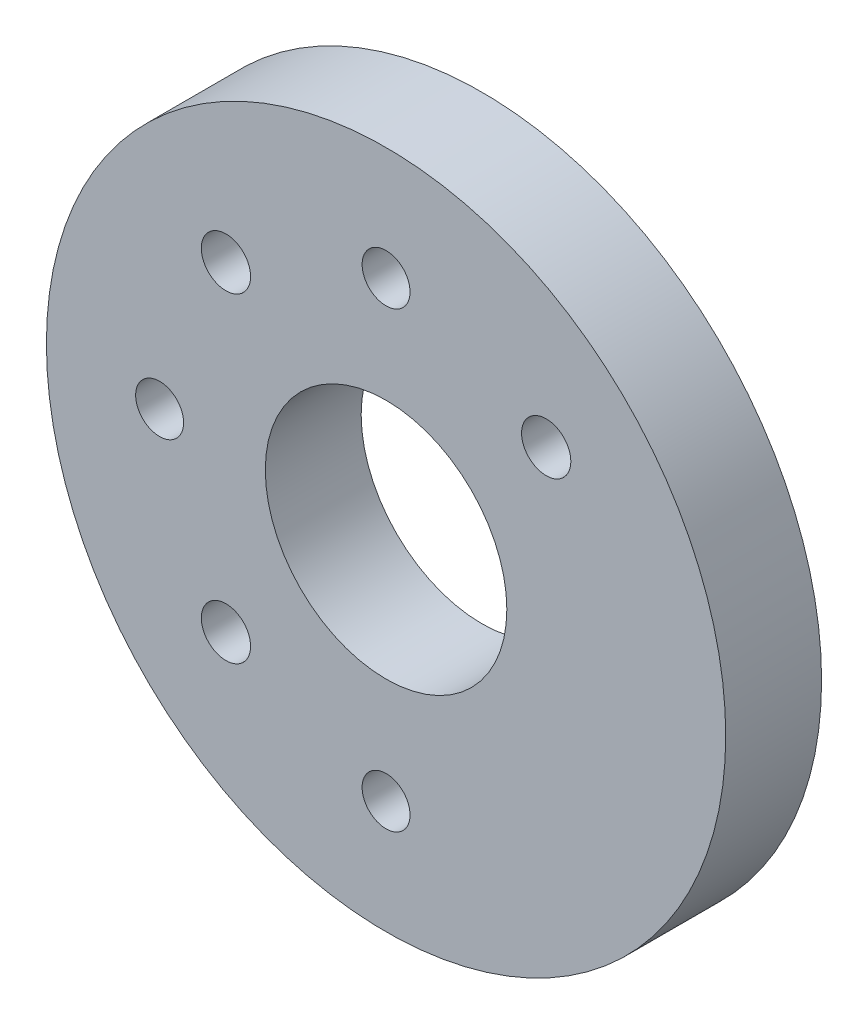
ISO-10303-21;
HEADER;
FILE_DESCRIPTION(('STEP AP214'),'2;1');
FILE_NAME('part.step','',(''),(''),'','','');
FILE_SCHEMA(('AUTOMOTIVE_DESIGN { 1 0 10303 214 1 1 1 1 }'));
ENDSEC;
DATA;
#1=APPLICATION_CONTEXT('core data for automotive mechanical design processes');
#2=APPLICATION_PROTOCOL_DEFINITION('international standard','automotive_design',2000,#1);
#3=PRODUCT_CONTEXT('',#1,'mechanical');
#4=PRODUCT('Part','Part','',(#3));
#5=PRODUCT_RELATED_PRODUCT_CATEGORY('part','',(#4));
#6=PRODUCT_DEFINITION_FORMATION('','',#4);
#7=PRODUCT_DEFINITION_CONTEXT('part definition',#1,'design');
#8=PRODUCT_DEFINITION('design','',#6,#7);
#9=PRODUCT_DEFINITION_SHAPE('','',#8);
#10=(LENGTH_UNIT() NAMED_UNIT(*) SI_UNIT(.MILLI.,.METRE.));
#11=(NAMED_UNIT(*) PLANE_ANGLE_UNIT() SI_UNIT($,.RADIAN.));
#12=(NAMED_UNIT(*) SI_UNIT($,.STERADIAN.) SOLID_ANGLE_UNIT());
#13=UNCERTAINTY_MEASURE_WITH_UNIT(LENGTH_MEASURE(1.E-05),#10,'distance_accuracy_value','');
#14=(GEOMETRIC_REPRESENTATION_CONTEXT(3) GLOBAL_UNCERTAINTY_ASSIGNED_CONTEXT((#13)) GLOBAL_UNIT_ASSIGNED_CONTEXT((#10,
#11,#12)) REPRESENTATION_CONTEXT('',''));
#15=CARTESIAN_POINT('',(0.,0.,0.));
#16=DIRECTION('',(0.,0.,1.));
#17=DIRECTION('',(1.,0.,0.));
#18=AXIS2_PLACEMENT_3D('',#15,#16,#17);
#19=CARTESIAN_POINT('',(0.,0.,6.35));
#20=DIRECTION('',(0.,0.,1.));
#21=DIRECTION('',(1.,0.,0.));
#22=AXIS2_PLACEMENT_3D('',#19,#20,#21);
#23=PLANE('',#22);
#24=CARTESIAN_POINT('',(10.6066017177982,10.6066017178002,6.35));
#25=DIRECTION('',(0.,0.,1.));
#26=DIRECTION('',(1.,0.,0.));
#27=AXIS2_PLACEMENT_3D('',#24,#25,#26);
#28=CIRCLE('',#27,1.63195);
#29=CARTESIAN_POINT('',(12.2385517177982,10.6066017178002,6.35));
#30=VERTEX_POINT('',#29);
#31=EDGE_CURVE('E71',#30,#30,#28,.T.);
#32=ORIENTED_EDGE('',*,*,#31,.F.);
#33=EDGE_LOOP('',(#32));
#34=FACE_BOUND('',#33,.T.);
#35=CARTESIAN_POINT('',(-14.9999999999987,-1.27897692436818E-12,6.35));
#36=DIRECTION('',(0.,0.,1.));
#37=DIRECTION('',(1.,0.,0.));
#38=AXIS2_PLACEMENT_3D('',#35,#36,#37);
#39=CIRCLE('',#38,1.5875);
#40=CARTESIAN_POINT('',(-13.4124999999987,-1.27897692436818E-12,6.35));
#41=VERTEX_POINT('',#40);
#42=EDGE_CURVE('E59',#41,#41,#39,.T.);
#43=ORIENTED_EDGE('',*,*,#42,.F.);
#44=EDGE_LOOP('',(#43));
#45=FACE_BOUND('',#44,.T.);
#46=CARTESIAN_POINT('',(0.,15.,6.35));
#47=DIRECTION('',(0.,0.,1.));
#48=DIRECTION('',(1.,0.,0.));
#49=AXIS2_PLACEMENT_3D('',#46,#47,#48);
#50=CIRCLE('',#49,1.5875);
#51=CARTESIAN_POINT('',(1.5875,15.,6.35));
#52=VERTEX_POINT('',#51);
#53=EDGE_CURVE('E47',#52,#52,#50,.T.);
#54=ORIENTED_EDGE('',*,*,#53,.F.);
#55=EDGE_LOOP('',(#54));
#56=FACE_BOUND('',#55,.T.);
#57=CARTESIAN_POINT('',(0.,0.,6.35));
#58=DIRECTION('',(0.,0.,1.));
#59=DIRECTION('',(1.,0.,0.));
#60=AXIS2_PLACEMENT_3D('',#57,#58,#59);
#61=CIRCLE('',#60,22.5);
#62=CARTESIAN_POINT('',(22.5,0.,6.35));
#63=VERTEX_POINT('',#62);
#64=EDGE_CURVE('E10',#63,#63,#61,.T.);
#65=ORIENTED_EDGE('',*,*,#64,.T.);
#66=EDGE_LOOP('',(#65));
#67=FACE_BOUND('',#66,.T.);
#68=CARTESIAN_POINT('',(0.,0.,6.35));
#69=DIRECTION('',(0.,0.,1.));
#70=DIRECTION('',(1.,0.,0.));
#71=AXIS2_PLACEMENT_3D('',#68,#69,#70);
#72=CIRCLE('',#71,8.);
#73=CARTESIAN_POINT('',(8.,0.,6.35));
#74=VERTEX_POINT('',#73);
#75=EDGE_CURVE('E42',#74,#74,#72,.T.);
#76=ORIENTED_EDGE('',*,*,#75,.F.);
#77=EDGE_LOOP('',(#76));
#78=FACE_BOUND('',#77,.T.);
#79=CARTESIAN_POINT('',(2.55427990833892E-12,-15.,6.35));
#80=DIRECTION('',(0.,0.,1.));
#81=DIRECTION('',(1.,0.,0.));
#82=AXIS2_PLACEMENT_3D('',#79,#80,#81);
#83=CIRCLE('',#82,1.5875);
#84=CARTESIAN_POINT('',(1.58750000000255,-15.,6.35));
#85=VERTEX_POINT('',#84);
#86=EDGE_CURVE('E53',#85,#85,#83,.T.);
#87=ORIENTED_EDGE('',*,*,#86,.F.);
#88=EDGE_LOOP('',(#87));
#89=FACE_BOUND('',#88,.T.);
#90=CARTESIAN_POINT('',(-10.6066017177983,10.6066017177982,6.35));
#91=DIRECTION('',(0.,0.,1.));
#92=DIRECTION('',(1.,0.,0.));
#93=AXIS2_PLACEMENT_3D('',#90,#91,#92);
#94=CIRCLE('',#93,1.63195);
#95=CARTESIAN_POINT('',(-8.97465171779827,10.6066017177982,6.35));
#96=VERTEX_POINT('',#95);
#97=EDGE_CURVE('E65',#96,#96,#94,.T.);
#98=ORIENTED_EDGE('',*,*,#97,.F.);
#99=EDGE_LOOP('',(#98));
#100=FACE_BOUND('',#99,.T.);
#101=CARTESIAN_POINT('',(-10.6066017177963,-10.6066017177983,6.35));
#102=DIRECTION('',(0.,0.,1.));
#103=DIRECTION('',(1.,0.,0.));
#104=AXIS2_PLACEMENT_3D('',#101,#102,#103);
#105=CIRCLE('',#104,1.63195);
#106=CARTESIAN_POINT('',(-8.97465171779625,-10.6066017177983,6.35));
#107=VERTEX_POINT('',#106);
#108=EDGE_CURVE('E77',#107,#107,#105,.T.);
#109=ORIENTED_EDGE('',*,*,#108,.F.);
#110=EDGE_LOOP('',(#109));
#111=FACE_BOUND('',#110,.T.);
#112=ADVANCED_FACE('F31',(#34,#45,#56,#67,#78,#89,#100,#111),#23,.T.);
#113=CARTESIAN_POINT('',(0.,0.,0.));
#114=DIRECTION('',(0.,0.,1.));
#115=DIRECTION('',(1.,0.,0.));
#116=AXIS2_PLACEMENT_3D('',#113,#114,#115);
#117=PLANE('',#116);
#118=CARTESIAN_POINT('',(0.,0.,0.));
#119=DIRECTION('',(0.,0.,1.));
#120=DIRECTION('',(1.,0.,0.));
#121=AXIS2_PLACEMENT_3D('',#118,#119,#120);
#122=CIRCLE('',#121,22.5);
#123=CARTESIAN_POINT('',(22.5,0.,0.));
#124=VERTEX_POINT('',#123);
#125=EDGE_CURVE('E35',#124,#124,#122,.T.);
#126=ORIENTED_EDGE('',*,*,#125,.F.);
#127=EDGE_LOOP('',(#126));
#128=FACE_BOUND('',#127,.T.);
#129=CARTESIAN_POINT('',(0.,0.,0.));
#130=DIRECTION('',(0.,0.,1.));
#131=DIRECTION('',(1.,0.,0.));
#132=AXIS2_PLACEMENT_3D('',#129,#130,#131);
#133=CIRCLE('',#132,8.);
#134=CARTESIAN_POINT('',(8.,0.,0.));
#135=VERTEX_POINT('',#134);
#136=EDGE_CURVE('E44',#135,#135,#133,.T.);
#137=ORIENTED_EDGE('',*,*,#136,.T.);
#138=EDGE_LOOP('',(#137));
#139=FACE_BOUND('',#138,.T.);
#140=CARTESIAN_POINT('',(0.,15.,0.));
#141=DIRECTION('',(0.,0.,1.));
#142=DIRECTION('',(1.,0.,0.));
#143=AXIS2_PLACEMENT_3D('',#140,#141,#142);
#144=CIRCLE('',#143,1.5875);
#145=CARTESIAN_POINT('',(1.5875,15.,0.));
#146=VERTEX_POINT('',#145);
#147=EDGE_CURVE('E50',#146,#146,#144,.T.);
#148=ORIENTED_EDGE('',*,*,#147,.T.);
#149=EDGE_LOOP('',(#148));
#150=FACE_BOUND('',#149,.T.);
#151=CARTESIAN_POINT('',(2.55427990833892E-12,-15.,0.));
#152=DIRECTION('',(0.,0.,1.));
#153=DIRECTION('',(1.,0.,0.));
#154=AXIS2_PLACEMENT_3D('',#151,#152,#153);
#155=CIRCLE('',#154,1.5875);
#156=CARTESIAN_POINT('',(1.58750000000255,-15.,0.));
#157=VERTEX_POINT('',#156);
#158=EDGE_CURVE('E56',#157,#157,#155,.T.);
#159=ORIENTED_EDGE('',*,*,#158,.T.);
#160=EDGE_LOOP('',(#159));
#161=FACE_BOUND('',#160,.T.);
#162=CARTESIAN_POINT('',(-14.9999999999987,-1.27897692436818E-12,0.));
#163=DIRECTION('',(0.,0.,1.));
#164=DIRECTION('',(1.,0.,0.));
#165=AXIS2_PLACEMENT_3D('',#162,#163,#164);
#166=CIRCLE('',#165,1.5875);
#167=CARTESIAN_POINT('',(-13.4124999999987,-1.27897692436818E-12,0.));
#168=VERTEX_POINT('',#167);
#169=EDGE_CURVE('E62',#168,#168,#166,.T.);
#170=ORIENTED_EDGE('',*,*,#169,.T.);
#171=EDGE_LOOP('',(#170));
#172=FACE_BOUND('',#171,.T.);
#173=CARTESIAN_POINT('',(-10.6066017177983,10.6066017177982,0.));
#174=DIRECTION('',(0.,0.,1.));
#175=DIRECTION('',(1.,0.,0.));
#176=AXIS2_PLACEMENT_3D('',#173,#174,#175);
#177=CIRCLE('',#176,1.63195);
#178=CARTESIAN_POINT('',(-8.97465171779827,10.6066017177982,0.));
#179=VERTEX_POINT('',#178);
#180=EDGE_CURVE('E68',#179,#179,#177,.T.);
#181=ORIENTED_EDGE('',*,*,#180,.T.);
#182=EDGE_LOOP('',(#181));
#183=FACE_BOUND('',#182,.T.);
#184=CARTESIAN_POINT('',(10.6066017177982,10.6066017178002,0.));
#185=DIRECTION('',(0.,0.,1.));
#186=DIRECTION('',(1.,0.,0.));
#187=AXIS2_PLACEMENT_3D('',#184,#185,#186);
#188=CIRCLE('',#187,1.63195);
#189=CARTESIAN_POINT('',(12.2385517177982,10.6066017178002,0.));
#190=VERTEX_POINT('',#189);
#191=EDGE_CURVE('E74',#190,#190,#188,.T.);
#192=ORIENTED_EDGE('',*,*,#191,.T.);
#193=EDGE_LOOP('',(#192));
#194=FACE_BOUND('',#193,.T.);
#195=CARTESIAN_POINT('',(-10.6066017177963,-10.6066017177983,0.));
#196=DIRECTION('',(0.,0.,1.));
#197=DIRECTION('',(1.,0.,0.));
#198=AXIS2_PLACEMENT_3D('',#195,#196,#197);
#199=CIRCLE('',#198,1.63195);
#200=CARTESIAN_POINT('',(-8.97465171779625,-10.6066017177983,0.));
#201=VERTEX_POINT('',#200);
#202=EDGE_CURVE('E80',#201,#201,#199,.T.);
#203=ORIENTED_EDGE('',*,*,#202,.T.);
#204=EDGE_LOOP('',(#203));
#205=FACE_BOUND('',#204,.T.);
#206=ADVANCED_FACE('F90',(#128,#139,#150,#161,#172,#183,#194,#205),#117,.F.);
#207=CARTESIAN_POINT('',(0.,0.,6.35));
#208=DIRECTION('',(0.,0.,-1.));
#209=DIRECTION('',(-1.,0.,0.));
#210=AXIS2_PLACEMENT_3D('',#207,#208,#209);
#211=CYLINDRICAL_SURFACE('',#210,22.5);
#212=ORIENTED_EDGE('',*,*,#64,.F.);
#213=EDGE_LOOP('',(#212));
#214=FACE_BOUND('',#213,.T.);
#215=ORIENTED_EDGE('',*,*,#125,.T.);
#216=EDGE_LOOP('',(#215));
#217=FACE_BOUND('',#216,.T.);
#218=ADVANCED_FACE('F33',(#214,#217),#211,.T.);
#219=CARTESIAN_POINT('',(0.,0.,6.35));
#220=DIRECTION('',(0.,0.,-1.));
#221=DIRECTION('',(-1.,0.,0.));
#222=AXIS2_PLACEMENT_3D('',#219,#220,#221);
#223=CYLINDRICAL_SURFACE('',#222,8.);
#224=ORIENTED_EDGE('',*,*,#75,.T.);
#225=EDGE_LOOP('',(#224));
#226=FACE_BOUND('',#225,.T.);
#227=ORIENTED_EDGE('',*,*,#136,.F.);
#228=EDGE_LOOP('',(#227));
#229=FACE_BOUND('',#228,.T.);
#230=ADVANCED_FACE('F100',(#226,#229),#223,.F.);
#231=CARTESIAN_POINT('',(0.,15.,6.35));
#232=DIRECTION('',(0.,0.,-1.));
#233=DIRECTION('',(-1.,0.,0.));
#234=AXIS2_PLACEMENT_3D('',#231,#232,#233);
#235=CYLINDRICAL_SURFACE('',#234,1.5875);
#236=ORIENTED_EDGE('',*,*,#53,.T.);
#237=EDGE_LOOP('',(#236));
#238=FACE_BOUND('',#237,.T.);
#239=ORIENTED_EDGE('',*,*,#147,.F.);
#240=EDGE_LOOP('',(#239));
#241=FACE_BOUND('',#240,.T.);
#242=ADVANCED_FACE('F103',(#238,#241),#235,.F.);
#243=CARTESIAN_POINT('',(2.55427990833892E-12,-15.,6.35));
#244=DIRECTION('',(0.,0.,-1.));
#245=DIRECTION('',(-1.,0.,0.));
#246=AXIS2_PLACEMENT_3D('',#243,#244,#245);
#247=CYLINDRICAL_SURFACE('',#246,1.5875);
#248=ORIENTED_EDGE('',*,*,#86,.T.);
#249=EDGE_LOOP('',(#248));
#250=FACE_BOUND('',#249,.T.);
#251=ORIENTED_EDGE('',*,*,#158,.F.);
#252=EDGE_LOOP('',(#251));
#253=FACE_BOUND('',#252,.T.);
#254=ADVANCED_FACE('F107',(#250,#253),#247,.F.);
#255=CARTESIAN_POINT('',(-14.9999999999987,-1.27897692436818E-12,6.35));
#256=DIRECTION('',(0.,0.,-1.));
#257=DIRECTION('',(-1.,0.,0.));
#258=AXIS2_PLACEMENT_3D('',#255,#256,#257);
#259=CYLINDRICAL_SURFACE('',#258,1.5875);
#260=ORIENTED_EDGE('',*,*,#42,.T.);
#261=EDGE_LOOP('',(#260));
#262=FACE_BOUND('',#261,.T.);
#263=ORIENTED_EDGE('',*,*,#169,.F.);
#264=EDGE_LOOP('',(#263));
#265=FACE_BOUND('',#264,.T.);
#266=ADVANCED_FACE('F111',(#262,#265),#259,.F.);
#267=CARTESIAN_POINT('',(-10.6066017177983,10.6066017177982,6.35));
#268=DIRECTION('',(0.,0.,-1.));
#269=DIRECTION('',(-1.,0.,0.));
#270=AXIS2_PLACEMENT_3D('',#267,#268,#269);
#271=CYLINDRICAL_SURFACE('',#270,1.63195);
#272=ORIENTED_EDGE('',*,*,#97,.T.);
#273=EDGE_LOOP('',(#272));
#274=FACE_BOUND('',#273,.T.);
#275=ORIENTED_EDGE('',*,*,#180,.F.);
#276=EDGE_LOOP('',(#275));
#277=FACE_BOUND('',#276,.T.);
#278=ADVANCED_FACE('F115',(#274,#277),#271,.F.);
#279=CARTESIAN_POINT('',(10.6066017177982,10.6066017178002,6.35));
#280=DIRECTION('',(0.,0.,-1.));
#281=DIRECTION('',(-1.,0.,0.));
#282=AXIS2_PLACEMENT_3D('',#279,#280,#281);
#283=CYLINDRICAL_SURFACE('',#282,1.63195);
#284=ORIENTED_EDGE('',*,*,#31,.T.);
#285=EDGE_LOOP('',(#284));
#286=FACE_BOUND('',#285,.T.);
#287=ORIENTED_EDGE('',*,*,#191,.F.);
#288=EDGE_LOOP('',(#287));
#289=FACE_BOUND('',#288,.T.);
#290=ADVANCED_FACE('F119',(#286,#289),#283,.F.);
#291=CARTESIAN_POINT('',(-10.6066017177963,-10.6066017177983,6.35));
#292=DIRECTION('',(0.,0.,-1.));
#293=DIRECTION('',(-1.,0.,0.));
#294=AXIS2_PLACEMENT_3D('',#291,#292,#293);
#295=CYLINDRICAL_SURFACE('',#294,1.63195);
#296=ORIENTED_EDGE('',*,*,#108,.T.);
#297=EDGE_LOOP('',(#296));
#298=FACE_BOUND('',#297,.T.);
#299=ORIENTED_EDGE('',*,*,#202,.F.);
#300=EDGE_LOOP('',(#299));
#301=FACE_BOUND('',#300,.T.);
#302=ADVANCED_FACE('F86',(#298,#301),#295,.F.);
#303=CLOSED_SHELL('',(#112,#206,#218,#230,#242,#254,#266,#278,#290,#302));
#304=MANIFOLD_SOLID_BREP('B2',#303);
#305=ADVANCED_BREP_SHAPE_REPRESENTATION('',(#18,#304),#14);
#306=SHAPE_DEFINITION_REPRESENTATION(#9,#305);
ENDSEC;
END-ISO-10303-21;
